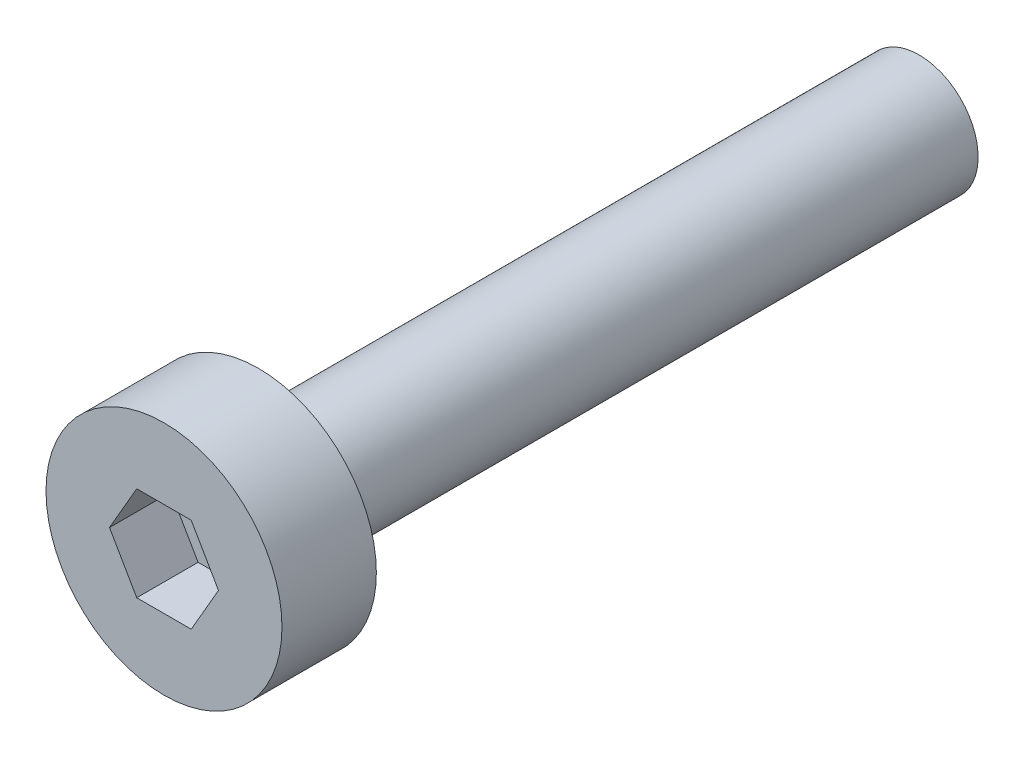
ISO-10303-21;
HEADER;
FILE_DESCRIPTION(('STEP AP214'),'2;1');
FILE_NAME('part.step','',(''),(''),'','','');
FILE_SCHEMA(('AUTOMOTIVE_DESIGN { 1 0 10303 214 1 1 1 1 }'));
ENDSEC;
DATA;
#1=APPLICATION_CONTEXT('core data for automotive mechanical design processes');
#2=APPLICATION_PROTOCOL_DEFINITION('international standard','automotive_design',2000,#1);
#3=PRODUCT_CONTEXT('',#1,'mechanical');
#4=PRODUCT('Part','Part','',(#3));
#5=PRODUCT_RELATED_PRODUCT_CATEGORY('part','',(#4));
#6=PRODUCT_DEFINITION_FORMATION('','',#4);
#7=PRODUCT_DEFINITION_CONTEXT('part definition',#1,'design');
#8=PRODUCT_DEFINITION('design','',#6,#7);
#9=PRODUCT_DEFINITION_SHAPE('','',#8);
#10=(LENGTH_UNIT() NAMED_UNIT(*) SI_UNIT(.MILLI.,.METRE.));
#11=(NAMED_UNIT(*) PLANE_ANGLE_UNIT() SI_UNIT($,.RADIAN.));
#12=(NAMED_UNIT(*) SI_UNIT($,.STERADIAN.) SOLID_ANGLE_UNIT());
#13=UNCERTAINTY_MEASURE_WITH_UNIT(LENGTH_MEASURE(1.E-05),#10,'distance_accuracy_value','');
#14=(GEOMETRIC_REPRESENTATION_CONTEXT(3) GLOBAL_UNCERTAINTY_ASSIGNED_CONTEXT((#13)) GLOBAL_UNIT_ASSIGNED_CONTEXT((#10,
#11,#12)) REPRESENTATION_CONTEXT('',''));
#15=CARTESIAN_POINT('',(0.,0.,0.));
#16=DIRECTION('',(0.,0.,1.));
#17=DIRECTION('',(1.,0.,0.));
#18=AXIS2_PLACEMENT_3D('',#15,#16,#17);
#19=CARTESIAN_POINT('',(0.,0.,0.7));
#20=DIRECTION('',(0.,0.,1.));
#21=DIRECTION('',(1.,0.,0.));
#22=AXIS2_PLACEMENT_3D('',#19,#20,#21);
#23=PLANE('',#22);
#24=DIRECTION('',(-0.50000000000019,0.866025403784329,0.));
#25=VECTOR('',#24,1.);
#26=CARTESIAN_POINT('',(1.154700538379,0.,0.7));
#27=LINE('',#26,#25);
#28=CARTESIAN_POINT('',(1.154700538379,0.,0.7));
#29=VERTEX_POINT('',#28);
#30=CARTESIAN_POINT('',(0.57735026919,1.,0.7));
#31=VERTEX_POINT('',#30);
#32=EDGE_CURVE('E9',#29,#31,#27,.T.);
#33=ORIENTED_EDGE('',*,*,#32,.T.);
#34=DIRECTION('',(-1.,0.,0.));
#35=VECTOR('',#34,1.);
#36=CARTESIAN_POINT('',(0.57735026919,1.,0.7));
#37=LINE('',#36,#35);
#38=CARTESIAN_POINT('',(-0.57735026919,1.,0.7));
#39=VERTEX_POINT('',#38);
#40=EDGE_CURVE('E113',#31,#39,#37,.T.);
#41=ORIENTED_EDGE('',*,*,#40,.T.);
#42=DIRECTION('',(-0.50000000000019,-0.866025403784329,0.));
#43=VECTOR('',#42,1.);
#44=CARTESIAN_POINT('',(-0.57735026919,1.,0.7));
#45=LINE('',#44,#43);
#46=CARTESIAN_POINT('',(-1.154700538379,0.,0.7));
#47=VERTEX_POINT('',#46);
#48=EDGE_CURVE('E69',#39,#47,#45,.T.);
#49=ORIENTED_EDGE('',*,*,#48,.T.);
#50=DIRECTION('',(0.50000000000019,-0.866025403784329,0.));
#51=VECTOR('',#50,1.);
#52=CARTESIAN_POINT('',(-1.154700538379,0.,0.7));
#53=LINE('',#52,#51);
#54=CARTESIAN_POINT('',(-0.57735026919,-1.,0.7));
#55=VERTEX_POINT('',#54);
#56=EDGE_CURVE('E79',#47,#55,#53,.T.);
#57=ORIENTED_EDGE('',*,*,#56,.T.);
#58=DIRECTION('',(1.,0.,0.));
#59=VECTOR('',#58,1.);
#60=CARTESIAN_POINT('',(-0.57735026919,-1.,0.7));
#61=LINE('',#60,#59);
#62=CARTESIAN_POINT('',(0.57735026919,-1.,0.7));
#63=VERTEX_POINT('',#62);
#64=EDGE_CURVE('E144',#55,#63,#61,.T.);
#65=ORIENTED_EDGE('',*,*,#64,.T.);
#66=DIRECTION('',(0.50000000000019,0.866025403784329,0.));
#67=VECTOR('',#66,1.);
#68=CARTESIAN_POINT('',(0.57735026919,-1.,0.7));
#69=LINE('',#68,#67);
#70=EDGE_CURVE('E169',#63,#29,#69,.T.);
#71=ORIENTED_EDGE('',*,*,#70,.T.);
#72=EDGE_LOOP('',(#33,#41,#49,#57,#65,#71));
#73=FACE_BOUND('',#72,.T.);
#74=ADVANCED_FACE('F14',(#73),#23,.T.);
#75=CARTESIAN_POINT('',(0.,0.,-14.));
#76=DIRECTION('',(0.,0.,-1.));
#77=DIRECTION('',(0.,-1.,0.));
#78=AXIS2_PLACEMENT_3D('',#75,#76,#77);
#79=PLANE('',#78);
#80=CARTESIAN_POINT('',(0.,0.,-14.));
#81=DIRECTION('',(0.,0.,-1.));
#82=DIRECTION('',(-1.,0.,0.));
#83=AXIS2_PLACEMENT_3D('',#80,#81,#82);
#84=CIRCLE('',#83,1.25);
#85=CARTESIAN_POINT('',(-1.25,0.,-14.));
#86=VERTEX_POINT('',#85);
#87=EDGE_CURVE('E170',#86,#86,#84,.T.);
#88=ORIENTED_EDGE('',*,*,#87,.T.);
#89=EDGE_LOOP('',(#88));
#90=FACE_BOUND('',#89,.T.);
#91=ADVANCED_FACE('F218',(#90),#79,.T.);
#92=CARTESIAN_POINT('',(1.154700538379,0.,0.7));
#93=DIRECTION('',(-0.866025403784329,-0.50000000000019,0.));
#94=DIRECTION('',(-0.50000000000019,0.866025403784329,0.));
#95=AXIS2_PLACEMENT_3D('',#92,#93,#94);
#96=PLANE('',#95);
#97=ORIENTED_EDGE('',*,*,#32,.F.);
#98=DIRECTION('',(0.,0.,1.));
#99=VECTOR('',#98,1.);
#100=CARTESIAN_POINT('',(1.154700538379,0.,0.7));
#101=LINE('',#100,#99);
#102=CARTESIAN_POINT('',(1.154700538379,0.,2.));
#103=VERTEX_POINT('',#102);
#104=EDGE_CURVE('E121',#29,#103,#101,.T.);
#105=ORIENTED_EDGE('',*,*,#104,.T.);
#106=DIRECTION('',(-0.50000000000019,0.866025403784329,0.));
#107=VECTOR('',#106,1.);
#108=CARTESIAN_POINT('',(1.010362971082,0.25,2.));
#109=LINE('',#108,#107);
#110=CARTESIAN_POINT('',(0.57735026919,1.,2.));
#111=VERTEX_POINT('',#110);
#112=EDGE_CURVE('E118',#103,#111,#109,.T.);
#113=ORIENTED_EDGE('',*,*,#112,.T.);
#114=DIRECTION('',(0.,0.,1.));
#115=VECTOR('',#114,1.);
#116=CARTESIAN_POINT('',(0.57735026919,1.,0.7));
#117=LINE('',#116,#115);
#118=EDGE_CURVE('E25',#31,#111,#117,.T.);
#119=ORIENTED_EDGE('',*,*,#118,.F.);
#120=EDGE_LOOP('',(#97,#105,#113,#119));
#121=FACE_BOUND('',#120,.T.);
#122=ADVANCED_FACE('F119',(#121),#96,.T.);
#123=CARTESIAN_POINT('',(0.57735026919,1.,0.7));
#124=DIRECTION('',(0.,-1.,0.));
#125=DIRECTION('',(-1.,0.,0.));
#126=AXIS2_PLACEMENT_3D('',#123,#124,#125);
#127=PLANE('',#126);
#128=ORIENTED_EDGE('',*,*,#40,.F.);
#129=ORIENTED_EDGE('',*,*,#118,.T.);
#130=DIRECTION('',(-1.,0.,0.));
#131=VECTOR('',#130,1.);
#132=CARTESIAN_POINT('',(0.288675134595,1.,2.));
#133=LINE('',#132,#131);
#134=CARTESIAN_POINT('',(-0.57735026919,1.,2.));
#135=VERTEX_POINT('',#134);
#136=EDGE_CURVE('E111',#111,#135,#133,.T.);
#137=ORIENTED_EDGE('',*,*,#136,.T.);
#138=DIRECTION('',(0.,0.,1.));
#139=VECTOR('',#138,1.);
#140=CARTESIAN_POINT('',(-0.57735026919,1.,0.7));
#141=LINE('',#140,#139);
#142=EDGE_CURVE('E101',#39,#135,#141,.T.);
#143=ORIENTED_EDGE('',*,*,#142,.F.);
#144=EDGE_LOOP('',(#128,#129,#137,#143));
#145=FACE_BOUND('',#144,.T.);
#146=ADVANCED_FACE('F109',(#145),#127,.T.);
#147=CARTESIAN_POINT('',(-0.57735026919,1.,0.7));
#148=DIRECTION('',(0.866025403784329,-0.50000000000019,0.));
#149=DIRECTION('',(0.,0.,-1.));
#150=AXIS2_PLACEMENT_3D('',#147,#148,#149);
#151=PLANE('',#150);
#152=ORIENTED_EDGE('',*,*,#48,.F.);
#153=ORIENTED_EDGE('',*,*,#142,.T.);
#154=DIRECTION('',(-0.50000000000019,-0.866025403784329,0.));
#155=VECTOR('',#154,1.);
#156=CARTESIAN_POINT('',(-0.721687836487,0.75,2.));
#157=LINE('',#156,#155);
#158=CARTESIAN_POINT('',(-1.154700538379,0.,2.));
#159=VERTEX_POINT('',#158);
#160=EDGE_CURVE('E132',#135,#159,#157,.T.);
#161=ORIENTED_EDGE('',*,*,#160,.T.);
#162=DIRECTION('',(0.,0.,1.));
#163=VECTOR('',#162,1.);
#164=CARTESIAN_POINT('',(-1.154700538379,0.,0.7));
#165=LINE('',#164,#163);
#166=EDGE_CURVE('E147',#47,#159,#165,.T.);
#167=ORIENTED_EDGE('',*,*,#166,.F.);
#168=EDGE_LOOP('',(#152,#153,#161,#167));
#169=FACE_BOUND('',#168,.T.);
#170=ADVANCED_FACE('F206',(#169),#151,.T.);
#171=CARTESIAN_POINT('',(-1.154700538379,0.,0.7));
#172=DIRECTION('',(0.866025403784329,0.50000000000019,0.));
#173=DIRECTION('',(0.,0.,-1.));
#174=AXIS2_PLACEMENT_3D('',#171,#172,#173);
#175=PLANE('',#174);
#176=ORIENTED_EDGE('',*,*,#56,.F.);
#177=ORIENTED_EDGE('',*,*,#166,.T.);
#178=DIRECTION('',(0.50000000000019,-0.866025403784329,0.));
#179=VECTOR('',#178,1.);
#180=CARTESIAN_POINT('',(-1.010362971082,-0.25,2.));
#181=LINE('',#180,#179);
#182=CARTESIAN_POINT('',(-0.57735026919,-1.,2.));
#183=VERTEX_POINT('',#182);
#184=EDGE_CURVE('E138',#159,#183,#181,.T.);
#185=ORIENTED_EDGE('',*,*,#184,.T.);
#186=DIRECTION('',(0.,0.,1.));
#187=VECTOR('',#186,1.);
#188=CARTESIAN_POINT('',(-0.57735026919,-1.,0.7));
#189=LINE('',#188,#187);
#190=EDGE_CURVE('E142',#55,#183,#189,.T.);
#191=ORIENTED_EDGE('',*,*,#190,.F.);
#192=EDGE_LOOP('',(#176,#177,#185,#191));
#193=FACE_BOUND('',#192,.T.);
#194=ADVANCED_FACE('F205',(#193),#175,.T.);
#195=CARTESIAN_POINT('',(-0.57735026919,-1.,0.7));
#196=DIRECTION('',(0.,1.,0.));
#197=DIRECTION('',(1.,0.,0.));
#198=AXIS2_PLACEMENT_3D('',#195,#196,#197);
#199=PLANE('',#198);
#200=ORIENTED_EDGE('',*,*,#64,.F.);
#201=ORIENTED_EDGE('',*,*,#190,.T.);
#202=DIRECTION('',(1.,0.,0.));
#203=VECTOR('',#202,1.);
#204=CARTESIAN_POINT('',(-0.288675134595,-1.,2.));
#205=LINE('',#204,#203);
#206=CARTESIAN_POINT('',(0.57735026919,-1.,2.));
#207=VERTEX_POINT('',#206);
#208=EDGE_CURVE('E157',#183,#207,#205,.T.);
#209=ORIENTED_EDGE('',*,*,#208,.T.);
#210=DIRECTION('',(0.,0.,1.));
#211=VECTOR('',#210,1.);
#212=CARTESIAN_POINT('',(0.57735026919,-1.,0.7));
#213=LINE('',#212,#211);
#214=EDGE_CURVE('E154',#63,#207,#213,.T.);
#215=ORIENTED_EDGE('',*,*,#214,.F.);
#216=EDGE_LOOP('',(#200,#201,#209,#215));
#217=FACE_BOUND('',#216,.T.);
#218=ADVANCED_FACE('F16',(#217),#199,.T.);
#219=CARTESIAN_POINT('',(0.57735026919,-1.,0.7));
#220=DIRECTION('',(-0.866025403784329,0.50000000000019,0.));
#221=DIRECTION('',(0.,0.,1.));
#222=AXIS2_PLACEMENT_3D('',#219,#220,#221);
#223=PLANE('',#222);
#224=ORIENTED_EDGE('',*,*,#70,.F.);
#225=ORIENTED_EDGE('',*,*,#214,.T.);
#226=DIRECTION('',(0.50000000000019,0.866025403784329,0.));
#227=VECTOR('',#226,1.);
#228=CARTESIAN_POINT('',(0.721687836487,-0.75,2.));
#229=LINE('',#228,#227);
#230=EDGE_CURVE('E126',#207,#103,#229,.T.);
#231=ORIENTED_EDGE('',*,*,#230,.T.);
#232=ORIENTED_EDGE('',*,*,#104,.F.);
#233=EDGE_LOOP('',(#224,#225,#231,#232));
#234=FACE_BOUND('',#233,.T.);
#235=ADVANCED_FACE('F201',(#234),#223,.T.);
#236=CARTESIAN_POINT('',(0.,0.,0.));
#237=DIRECTION('',(0.,0.,-1.));
#238=DIRECTION('',(-1.,0.,0.));
#239=AXIS2_PLACEMENT_3D('',#236,#237,#238);
#240=CYLINDRICAL_SURFACE('',#239,1.25);
#241=ORIENTED_EDGE('',*,*,#87,.F.);
#242=DIRECTION('',(0.,0.,-1.));
#243=VECTOR('',#242,1.);
#244=CARTESIAN_POINT('',(-1.25,0.,0.));
#245=LINE('',#244,#243);
#246=CARTESIAN_POINT('',(-1.25,0.,0.));
#247=VERTEX_POINT('',#246);
#248=EDGE_CURVE('E167',#247,#86,#245,.T.);
#249=ORIENTED_EDGE('',*,*,#248,.F.);
#250=CARTESIAN_POINT('',(0.,0.,0.));
#251=DIRECTION('',(0.,0.,-1.));
#252=DIRECTION('',(-1.,0.,0.));
#253=AXIS2_PLACEMENT_3D('',#250,#251,#252);
#254=CIRCLE('',#253,1.25);
#255=EDGE_CURVE('E161',#247,#247,#254,.T.);
#256=ORIENTED_EDGE('',*,*,#255,.T.);
#257=ORIENTED_EDGE('',*,*,#248,.T.);
#258=EDGE_LOOP('',(#241,#249,#256,#257));
#259=FACE_BOUND('',#258,.T.);
#260=ADVANCED_FACE('F233',(#259),#240,.T.);
#261=CARTESIAN_POINT('',(0.,0.,2.));
#262=DIRECTION('',(0.,0.,-1.));
#263=DIRECTION('',(0.,-1.,0.));
#264=AXIS2_PLACEMENT_3D('',#261,#262,#263);
#265=PLANE('',#264);
#266=ORIENTED_EDGE('',*,*,#208,.F.);
#267=ORIENTED_EDGE('',*,*,#184,.F.);
#268=ORIENTED_EDGE('',*,*,#160,.F.);
#269=ORIENTED_EDGE('',*,*,#136,.F.);
#270=ORIENTED_EDGE('',*,*,#112,.F.);
#271=ORIENTED_EDGE('',*,*,#230,.F.);
#272=EDGE_LOOP('',(#266,#267,#268,#269,#270,#271));
#273=FACE_BOUND('',#272,.T.);
#274=CARTESIAN_POINT('',(0.,0.,2.));
#275=DIRECTION('',(0.,0.,-1.));
#276=DIRECTION('',(-1.,0.,0.));
#277=AXIS2_PLACEMENT_3D('',#274,#275,#276);
#278=CIRCLE('',#277,2.5);
#279=CARTESIAN_POINT('',(-2.5,0.,2.));
#280=VERTEX_POINT('',#279);
#281=EDGE_CURVE('E251',#280,#280,#278,.T.);
#282=ORIENTED_EDGE('',*,*,#281,.F.);
#283=EDGE_LOOP('',(#282));
#284=FACE_BOUND('',#283,.T.);
#285=ADVANCED_FACE('F129',(#273,#284),#265,.F.);
#286=CARTESIAN_POINT('',(0.,0.,0.));
#287=DIRECTION('',(0.,0.,-1.));
#288=DIRECTION('',(0.,-1.,0.));
#289=AXIS2_PLACEMENT_3D('',#286,#287,#288);
#290=PLANE('',#289);
#291=ORIENTED_EDGE('',*,*,#255,.F.);
#292=EDGE_LOOP('',(#291));
#293=FACE_BOUND('',#292,.T.);
#294=CARTESIAN_POINT('',(0.,0.,0.));
#295=DIRECTION('',(0.,0.,-1.));
#296=DIRECTION('',(-1.,0.,0.));
#297=AXIS2_PLACEMENT_3D('',#294,#295,#296);
#298=CIRCLE('',#297,2.5);
#299=CARTESIAN_POINT('',(-2.5,0.,0.));
#300=VERTEX_POINT('',#299);
#301=EDGE_CURVE('E148',#300,#300,#298,.T.);
#302=ORIENTED_EDGE('',*,*,#301,.T.);
#303=EDGE_LOOP('',(#302));
#304=FACE_BOUND('',#303,.T.);
#305=ADVANCED_FACE('F226',(#293,#304),#290,.T.);
#306=CARTESIAN_POINT('',(0.,0.,2.));
#307=DIRECTION('',(0.,0.,-1.));
#308=DIRECTION('',(-1.,0.,0.));
#309=AXIS2_PLACEMENT_3D('',#306,#307,#308);
#310=CYLINDRICAL_SURFACE('',#309,2.5);
#311=ORIENTED_EDGE('',*,*,#301,.F.);
#312=DIRECTION('',(0.,0.,-1.));
#313=VECTOR('',#312,1.);
#314=CARTESIAN_POINT('',(-2.5,0.,2.));
#315=LINE('',#314,#313);
#316=EDGE_CURVE('E18',#280,#300,#315,.T.);
#317=ORIENTED_EDGE('',*,*,#316,.F.);
#318=ORIENTED_EDGE('',*,*,#281,.T.);
#319=ORIENTED_EDGE('',*,*,#316,.T.);
#320=EDGE_LOOP('',(#311,#317,#318,#319));
#321=FACE_BOUND('',#320,.T.);
#322=ADVANCED_FACE('F229',(#321),#310,.T.);
#323=CLOSED_SHELL('',(#74,#91,#122,#146,#170,#194,#218,#235,#260,#285,#305,#322));
#324=MANIFOLD_SOLID_BREP('B1',#323);
#325=ADVANCED_BREP_SHAPE_REPRESENTATION('',(#18,#324),#14);
#326=SHAPE_DEFINITION_REPRESENTATION(#9,#325);
ENDSEC;
END-ISO-10303-21;
